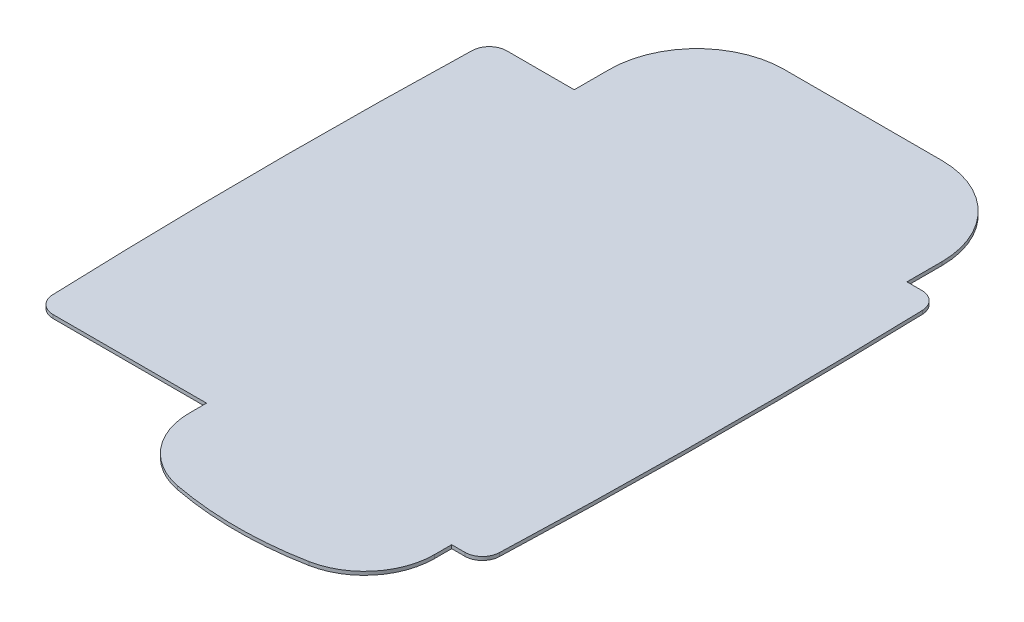
ISO-10303-21;
HEADER;
FILE_DESCRIPTION(('STEP AP214'),'2;1');
FILE_NAME('part.step','',(''),(''),'','','');
FILE_SCHEMA(('AUTOMOTIVE_DESIGN { 1 0 10303 214 1 1 1 1 }'));
ENDSEC;
DATA;
#1=APPLICATION_CONTEXT('core data for automotive mechanical design processes');
#2=APPLICATION_PROTOCOL_DEFINITION('international standard','automotive_design',2000,#1);
#3=PRODUCT_CONTEXT('',#1,'mechanical');
#4=PRODUCT('Part','Part','',(#3));
#5=PRODUCT_RELATED_PRODUCT_CATEGORY('part','',(#4));
#6=PRODUCT_DEFINITION_FORMATION('','',#4);
#7=PRODUCT_DEFINITION_CONTEXT('part definition',#1,'design');
#8=PRODUCT_DEFINITION('design','',#6,#7);
#9=PRODUCT_DEFINITION_SHAPE('','',#8);
#10=(LENGTH_UNIT() NAMED_UNIT(*) SI_UNIT(.MILLI.,.METRE.));
#11=(NAMED_UNIT(*) PLANE_ANGLE_UNIT() SI_UNIT($,.RADIAN.));
#12=(NAMED_UNIT(*) SI_UNIT($,.STERADIAN.) SOLID_ANGLE_UNIT());
#13=UNCERTAINTY_MEASURE_WITH_UNIT(LENGTH_MEASURE(1.E-05),#10,'distance_accuracy_value','');
#14=(GEOMETRIC_REPRESENTATION_CONTEXT(3) GLOBAL_UNCERTAINTY_ASSIGNED_CONTEXT((#13)) GLOBAL_UNIT_ASSIGNED_CONTEXT((#10,
#11,#12)) REPRESENTATION_CONTEXT('',''));
#15=CARTESIAN_POINT('',(0.,0.,0.));
#16=DIRECTION('',(0.,0.,1.));
#17=DIRECTION('',(1.,0.,0.));
#18=AXIS2_PLACEMENT_3D('',#15,#16,#17);
#19=CARTESIAN_POINT('',(0.,0.5,-92.5));
#20=DIRECTION('',(0.,0.,-1.));
#21=DIRECTION('',(-1.,0.,0.));
#22=AXIS2_PLACEMENT_3D('',#19,#20,#21);
#23=PLANE('',#22);
#24=DIRECTION('',(1.,0.,0.));
#25=VECTOR('',#24,1.);
#26=CARTESIAN_POINT('',(0.,-0.5,-92.5));
#27=LINE('',#26,#25);
#28=CARTESIAN_POINT('',(-15.,-0.5,-92.5));
#29=VERTEX_POINT('',#28);
#30=CARTESIAN_POINT('',(30.,-0.5,-92.5));
#31=VERTEX_POINT('',#30);
#32=EDGE_CURVE('E196',#29,#31,#27,.T.);
#33=ORIENTED_EDGE('',*,*,#32,.F.);
#34=DIRECTION('',(0.,1.,0.));
#35=VECTOR('',#34,1.);
#36=CARTESIAN_POINT('',(-15.,-0.5,-92.5));
#37=LINE('',#36,#35);
#38=CARTESIAN_POINT('',(-15.,0.5,-92.5));
#39=VERTEX_POINT('',#38);
#40=EDGE_CURVE('E179',#29,#39,#37,.T.);
#41=ORIENTED_EDGE('',*,*,#40,.T.);
#42=DIRECTION('',(1.,0.,0.));
#43=VECTOR('',#42,1.);
#44=CARTESIAN_POINT('',(0.,0.5,-92.5));
#45=LINE('',#44,#43);
#46=CARTESIAN_POINT('',(30.,0.5,-92.5));
#47=VERTEX_POINT('',#46);
#48=EDGE_CURVE('E337',#39,#47,#45,.T.);
#49=ORIENTED_EDGE('',*,*,#48,.T.);
#50=DIRECTION('',(0.,1.,0.));
#51=VECTOR('',#50,1.);
#52=CARTESIAN_POINT('',(30.,-0.5,-92.5));
#53=LINE('',#52,#51);
#54=EDGE_CURVE('E201',#31,#47,#53,.T.);
#55=ORIENTED_EDGE('',*,*,#54,.F.);
#56=EDGE_LOOP('',(#33,#41,#49,#55));
#57=FACE_BOUND('',#56,.T.);
#58=ADVANCED_FACE('F42',(#57),#23,.T.);
#59=CARTESIAN_POINT('',(0.,0.5,0.));
#60=DIRECTION('',(0.,1.,0.));
#61=DIRECTION('',(0.,0.,1.));
#62=AXIS2_PLACEMENT_3D('',#59,#60,#61);
#63=PLANE('',#62);
#64=DIRECTION('',(0.,0.,-1.));
#65=VECTOR('',#64,1.);
#66=CARTESIAN_POINT('',(-15.,0.5,72.5));
#67=LINE('',#66,#65);
#68=CARTESIAN_POINT('',(-15.,0.5,77.4061982515326));
#69=VERTEX_POINT('',#68);
#70=CARTESIAN_POINT('',(-15.,0.5,72.5));
#71=VERTEX_POINT('',#70);
#72=EDGE_CURVE('E290',#69,#71,#67,.T.);
#73=ORIENTED_EDGE('',*,*,#72,.F.);
#74=CARTESIAN_POINT('',(5.00000000000002,0.5,77.4061982515326));
#75=DIRECTION('',(0.,1.,0.));
#76=DIRECTION('',(0.,0.,1.));
#77=AXIS2_PLACEMENT_3D('',#74,#75,#76);
#78=CIRCLE('',#77,20.);
#79=CARTESIAN_POINT('',(1.25000000000002,0.5,97.0514903084097));
#80=VERTEX_POINT('',#79);
#81=EDGE_CURVE('E258',#69,#80,#78,.T.);
#82=ORIENTED_EDGE('',*,*,#81,.T.);
#83=CARTESIAN_POINT('',(20.,0.5,-1.17496997597598));
#84=DIRECTION('',(0.,1.,0.));
#85=DIRECTION('',(0.,0.,1.));
#86=AXIS2_PLACEMENT_3D('',#83,#84,#85);
#87=CIRCLE('',#86,100.);
#88=CARTESIAN_POINT('',(38.75,0.5,97.0514903084097));
#89=VERTEX_POINT('',#88);
#90=EDGE_CURVE('E288',#80,#89,#87,.T.);
#91=ORIENTED_EDGE('',*,*,#90,.T.);
#92=CARTESIAN_POINT('',(35.,0.5,77.4061982515326));
#93=DIRECTION('',(0.,1.,0.));
#94=DIRECTION('',(0.,0.,1.));
#95=AXIS2_PLACEMENT_3D('',#92,#93,#94);
#96=CIRCLE('',#95,20.);
#97=CARTESIAN_POINT('',(55.,0.5,77.4061982515326));
#98=VERTEX_POINT('',#97);
#99=EDGE_CURVE('E256',#89,#98,#96,.T.);
#100=ORIENTED_EDGE('',*,*,#99,.T.);
#101=DIRECTION('',(0.,0.,1.));
#102=VECTOR('',#101,1.);
#103=CARTESIAN_POINT('',(55.,0.5,72.5));
#104=LINE('',#103,#102);
#105=CARTESIAN_POINT('',(55.,0.5,72.5));
#106=VERTEX_POINT('',#105);
#107=EDGE_CURVE('E294',#106,#98,#104,.T.);
#108=ORIENTED_EDGE('',*,*,#107,.F.);
#109=DIRECTION('',(-1.,0.,0.));
#110=VECTOR('',#109,1.);
#111=CARTESIAN_POINT('',(55.,0.5,72.5));
#112=LINE('',#111,#110);
#113=CARTESIAN_POINT('',(58.7764057886327,0.5,72.5));
#114=VERTEX_POINT('',#113);
#115=EDGE_CURVE('E296',#114,#106,#112,.T.);
#116=ORIENTED_EDGE('',*,*,#115,.F.);
#117=CARTESIAN_POINT('',(58.7764057886327,0.5,67.5));
#118=DIRECTION('',(0.,1.,0.));
#119=DIRECTION('',(0.,0.,1.));
#120=AXIS2_PLACEMENT_3D('',#117,#118,#119);
#121=CIRCLE('',#120,5.);
#122=CARTESIAN_POINT('',(63.7730594606828,0.5,67.6828991022093));
#123=VERTEX_POINT('',#122);
#124=EDGE_CURVE('E235',#114,#123,#121,.T.);
#125=ORIENTED_EDGE('',*,*,#124,.T.);
#126=CARTESIAN_POINT('',(0.,0.5,0.));
#127=DIRECTION('',(0.,1.,0.));
#128=DIRECTION('',(0.,0.,1.));
#129=AXIS2_PLACEMENT_3D('',#126,#127,#128);
#130=ELLIPSE('',#129,350.,65.);
#131=CARTESIAN_POINT('',(64.2606055592189,0.5,-52.6412109634021));
#132=VERTEX_POINT('',#131);
#133=EDGE_CURVE('E206',#123,#132,#130,.T.);
#134=ORIENTED_EDGE('',*,*,#133,.T.);
#135=CARTESIAN_POINT('',(59.262600010621,0.5,-52.5));
#136=DIRECTION('',(0.,1.,0.));
#137=DIRECTION('',(0.,0.,1.));
#138=AXIS2_PLACEMENT_3D('',#135,#136,#137);
#139=CIRCLE('',#138,5.);
#140=CARTESIAN_POINT('',(59.262600010621,0.5,-57.5));
#141=VERTEX_POINT('',#140);
#142=EDGE_CURVE('E233',#132,#141,#139,.T.);
#143=ORIENTED_EDGE('',*,*,#142,.T.);
#144=DIRECTION('',(1.,0.,0.));
#145=VECTOR('',#144,1.);
#146=CARTESIAN_POINT('',(55.,0.5,-57.5));
#147=LINE('',#146,#145);
#148=CARTESIAN_POINT('',(55.,0.5,-57.5));
#149=VERTEX_POINT('',#148);
#150=EDGE_CURVE('E318',#149,#141,#147,.T.);
#151=ORIENTED_EDGE('',*,*,#150,.F.);
#152=DIRECTION('',(0.,0.,1.));
#153=VECTOR('',#152,1.);
#154=CARTESIAN_POINT('',(55.,0.5,-92.5));
#155=LINE('',#154,#153);
#156=CARTESIAN_POINT('',(55.,0.5,-67.5));
#157=VERTEX_POINT('',#156);
#158=EDGE_CURVE('E314',#157,#149,#155,.T.);
#159=ORIENTED_EDGE('',*,*,#158,.F.);
#160=CARTESIAN_POINT('',(30.,0.5,-67.5));
#161=DIRECTION('',(0.,1.,0.));
#162=DIRECTION('',(0.,0.,1.));
#163=AXIS2_PLACEMENT_3D('',#160,#161,#162);
#164=CIRCLE('',#163,25.);
#165=EDGE_CURVE('E399',#157,#47,#164,.T.);
#166=ORIENTED_EDGE('',*,*,#165,.T.);
#167=ORIENTED_EDGE('',*,*,#48,.F.);
#168=CARTESIAN_POINT('',(-15.,0.5,-67.5));
#169=DIRECTION('',(0.,1.,0.));
#170=DIRECTION('',(0.,0.,1.));
#171=AXIS2_PLACEMENT_3D('',#168,#169,#170);
#172=CIRCLE('',#171,25.);
#173=CARTESIAN_POINT('',(-40.,0.5,-67.5));
#174=VERTEX_POINT('',#173);
#175=EDGE_CURVE('E185',#39,#174,#172,.T.);
#176=ORIENTED_EDGE('',*,*,#175,.T.);
#177=DIRECTION('',(0.,0.,-1.));
#178=VECTOR('',#177,1.);
#179=CARTESIAN_POINT('',(-40.,0.5,-92.5));
#180=LINE('',#179,#178);
#181=CARTESIAN_POINT('',(-40.,0.5,-57.5));
#182=VERTEX_POINT('',#181);
#183=EDGE_CURVE('E329',#182,#174,#180,.T.);
#184=ORIENTED_EDGE('',*,*,#183,.F.);
#185=DIRECTION('',(1.,0.,0.));
#186=VECTOR('',#185,1.);
#187=CARTESIAN_POINT('',(-65.,0.5,-57.5));
#188=LINE('',#187,#186);
#189=CARTESIAN_POINT('',(-59.262600010621,0.5,-57.5));
#190=VERTEX_POINT('',#189);
#191=EDGE_CURVE('E327',#190,#182,#188,.T.);
#192=ORIENTED_EDGE('',*,*,#191,.F.);
#193=CARTESIAN_POINT('',(-59.262600010621,0.5,-52.5000000000001));
#194=DIRECTION('',(0.,1.,0.));
#195=DIRECTION('',(0.,0.,1.));
#196=AXIS2_PLACEMENT_3D('',#193,#194,#195);
#197=CIRCLE('',#196,5.);
#198=CARTESIAN_POINT('',(-64.2606055592189,0.5,-52.6412109634022));
#199=VERTEX_POINT('',#198);
#200=EDGE_CURVE('E239',#190,#199,#197,.T.);
#201=ORIENTED_EDGE('',*,*,#200,.T.);
#202=CARTESIAN_POINT('',(-63.7730594606828,0.5,67.6828991022094));
#203=VERTEX_POINT('',#202);
#204=EDGE_CURVE('E215',#199,#203,#130,.T.);
#205=ORIENTED_EDGE('',*,*,#204,.T.);
#206=CARTESIAN_POINT('',(-58.7764057886327,0.5,67.5000000000001));
#207=DIRECTION('',(0.,1.,0.));
#208=DIRECTION('',(0.,0.,1.));
#209=AXIS2_PLACEMENT_3D('',#206,#207,#208);
#210=CIRCLE('',#209,5.);
#211=CARTESIAN_POINT('',(-58.7764057886327,0.5,72.5));
#212=VERTEX_POINT('',#211);
#213=EDGE_CURVE('E237',#203,#212,#210,.T.);
#214=ORIENTED_EDGE('',*,*,#213,.T.);
#215=DIRECTION('',(-1.,0.,0.));
#216=VECTOR('',#215,1.);
#217=CARTESIAN_POINT('',(-65.,0.5,72.5));
#218=LINE('',#217,#216);
#219=EDGE_CURVE('E281',#71,#212,#218,.T.);
#220=ORIENTED_EDGE('',*,*,#219,.F.);
#221=EDGE_LOOP('',(#73,#82,#91,#100,#108,#116,#125,#134,#143,#151,#159,#166,#167,#176,#184,#192,
#201,#205,#214,#220));
#222=FACE_BOUND('',#221,.T.);
#223=ADVANCED_FACE('F287',(#222),#63,.T.);
#224=CARTESIAN_POINT('',(0.,-0.5,0.));
#225=DIRECTION('',(0.,1.,0.));
#226=DIRECTION('',(0.,0.,1.));
#227=AXIS2_PLACEMENT_3D('',#224,#225,#226);
#228=PLANE('',#227);
#229=CARTESIAN_POINT('',(20.,-0.5,-1.17496997597598));
#230=DIRECTION('',(0.,1.,0.));
#231=DIRECTION('',(0.,0.,1.));
#232=AXIS2_PLACEMENT_3D('',#229,#230,#231);
#233=CIRCLE('',#232,100.);
#234=CARTESIAN_POINT('',(1.25000000000002,-0.5,97.0514903084097));
#235=VERTEX_POINT('',#234);
#236=CARTESIAN_POINT('',(38.75,-0.5,97.0514903084097));
#237=VERTEX_POINT('',#236);
#238=EDGE_CURVE('E270',#235,#237,#233,.T.);
#239=ORIENTED_EDGE('',*,*,#238,.F.);
#240=CARTESIAN_POINT('',(5.00000000000002,-0.5,77.4061982515326));
#241=DIRECTION('',(0.,1.,0.));
#242=DIRECTION('',(0.,0.,1.));
#243=AXIS2_PLACEMENT_3D('',#240,#241,#242);
#244=CIRCLE('',#243,20.);
#245=CARTESIAN_POINT('',(-15.,-0.5,77.4061982515326));
#246=VERTEX_POINT('',#245);
#247=EDGE_CURVE('E50',#235,#246,#244,.F.);
#248=ORIENTED_EDGE('',*,*,#247,.T.);
#249=DIRECTION('',(0.,0.,-1.));
#250=VECTOR('',#249,1.);
#251=CARTESIAN_POINT('',(-15.,-0.5,72.5));
#252=LINE('',#251,#250);
#253=CARTESIAN_POINT('',(-15.,-0.5,72.5));
#254=VERTEX_POINT('',#253);
#255=EDGE_CURVE('E268',#246,#254,#252,.T.);
#256=ORIENTED_EDGE('',*,*,#255,.T.);
#257=DIRECTION('',(-1.,0.,0.));
#258=VECTOR('',#257,1.);
#259=CARTESIAN_POINT('',(-65.,-0.5,72.5));
#260=LINE('',#259,#258);
#261=CARTESIAN_POINT('',(-58.7764057886327,-0.5,72.5));
#262=VERTEX_POINT('',#261);
#263=EDGE_CURVE('E280',#254,#262,#260,.T.);
#264=ORIENTED_EDGE('',*,*,#263,.T.);
#265=CARTESIAN_POINT('',(-58.7764057886327,-0.5,67.5000000000001));
#266=DIRECTION('',(0.,1.,0.));
#267=DIRECTION('',(0.,0.,1.));
#268=AXIS2_PLACEMENT_3D('',#265,#266,#267);
#269=CIRCLE('',#268,5.);
#270=CARTESIAN_POINT('',(-63.7730594606828,-0.5,67.6828991022094));
#271=VERTEX_POINT('',#270);
#272=EDGE_CURVE('E227',#262,#271,#269,.F.);
#273=ORIENTED_EDGE('',*,*,#272,.T.);
#274=CARTESIAN_POINT('',(0.,-0.5,0.));
#275=DIRECTION('',(0.,1.,0.));
#276=DIRECTION('',(0.,0.,1.));
#277=AXIS2_PLACEMENT_3D('',#274,#275,#276);
#278=ELLIPSE('',#277,350.,65.);
#279=CARTESIAN_POINT('',(-64.2606055592189,-0.5,-52.6412109634022));
#280=VERTEX_POINT('',#279);
#281=EDGE_CURVE('E202',#280,#271,#278,.T.);
#282=ORIENTED_EDGE('',*,*,#281,.F.);
#283=CARTESIAN_POINT('',(-59.262600010621,-0.5,-52.5000000000001));
#284=DIRECTION('',(0.,1.,0.));
#285=DIRECTION('',(0.,0.,1.));
#286=AXIS2_PLACEMENT_3D('',#283,#284,#285);
#287=CIRCLE('',#286,5.);
#288=CARTESIAN_POINT('',(-59.262600010621,-0.5,-57.5));
#289=VERTEX_POINT('',#288);
#290=EDGE_CURVE('E229',#280,#289,#287,.F.);
#291=ORIENTED_EDGE('',*,*,#290,.T.);
#292=DIRECTION('',(1.,0.,0.));
#293=VECTOR('',#292,1.);
#294=CARTESIAN_POINT('',(0.,-0.5,-57.5));
#295=LINE('',#294,#293);
#296=CARTESIAN_POINT('',(-40.,-0.5,-57.5));
#297=VERTEX_POINT('',#296);
#298=EDGE_CURVE('E212',#289,#297,#295,.T.);
#299=ORIENTED_EDGE('',*,*,#298,.T.);
#300=DIRECTION('',(0.,0.,-1.));
#301=VECTOR('',#300,1.);
#302=CARTESIAN_POINT('',(-40.,-0.5,-92.5));
#303=LINE('',#302,#301);
#304=CARTESIAN_POINT('',(-40.,-0.5,-67.5));
#305=VERTEX_POINT('',#304);
#306=EDGE_CURVE('E198',#297,#305,#303,.T.);
#307=ORIENTED_EDGE('',*,*,#306,.T.);
#308=CARTESIAN_POINT('',(-15.,-0.5,-67.5));
#309=DIRECTION('',(0.,1.,0.));
#310=DIRECTION('',(0.,0.,1.));
#311=AXIS2_PLACEMENT_3D('',#308,#309,#310);
#312=CIRCLE('',#311,25.);
#313=EDGE_CURVE('E182',#29,#305,#312,.T.);
#314=ORIENTED_EDGE('',*,*,#313,.F.);
#315=ORIENTED_EDGE('',*,*,#32,.T.);
#316=CARTESIAN_POINT('',(30.,-0.5,-67.5));
#317=DIRECTION('',(0.,1.,0.));
#318=DIRECTION('',(0.,0.,1.));
#319=AXIS2_PLACEMENT_3D('',#316,#317,#318);
#320=CIRCLE('',#319,25.);
#321=CARTESIAN_POINT('',(55.,-0.5,-67.5));
#322=VERTEX_POINT('',#321);
#323=EDGE_CURVE('E401',#322,#31,#320,.T.);
#324=ORIENTED_EDGE('',*,*,#323,.F.);
#325=DIRECTION('',(0.,0.,1.));
#326=VECTOR('',#325,1.);
#327=CARTESIAN_POINT('',(55.,-0.5,-92.5));
#328=LINE('',#327,#326);
#329=CARTESIAN_POINT('',(55.,-0.5,-57.5));
#330=VERTEX_POINT('',#329);
#331=EDGE_CURVE('E315',#322,#330,#328,.T.);
#332=ORIENTED_EDGE('',*,*,#331,.T.);
#333=DIRECTION('',(1.,0.,0.));
#334=VECTOR('',#333,1.);
#335=CARTESIAN_POINT('',(55.,-0.5,-57.5));
#336=LINE('',#335,#334);
#337=CARTESIAN_POINT('',(59.262600010621,-0.5,-57.5));
#338=VERTEX_POINT('',#337);
#339=EDGE_CURVE('E317',#330,#338,#336,.T.);
#340=ORIENTED_EDGE('',*,*,#339,.T.);
#341=CARTESIAN_POINT('',(59.262600010621,-0.5,-52.5));
#342=DIRECTION('',(0.,1.,0.));
#343=DIRECTION('',(0.,0.,1.));
#344=AXIS2_PLACEMENT_3D('',#341,#342,#343);
#345=CIRCLE('',#344,5.);
#346=CARTESIAN_POINT('',(64.2606055592189,-0.5,-52.6412109634021));
#347=VERTEX_POINT('',#346);
#348=EDGE_CURVE('E223',#338,#347,#345,.F.);
#349=ORIENTED_EDGE('',*,*,#348,.T.);
#350=CARTESIAN_POINT('',(63.7730594606828,-0.5,67.6828991022093));
#351=VERTEX_POINT('',#350);
#352=EDGE_CURVE('E203',#351,#347,#278,.T.);
#353=ORIENTED_EDGE('',*,*,#352,.F.);
#354=CARTESIAN_POINT('',(58.7764057886327,-0.5,67.5));
#355=DIRECTION('',(0.,1.,0.));
#356=DIRECTION('',(0.,0.,1.));
#357=AXIS2_PLACEMENT_3D('',#354,#355,#356);
#358=CIRCLE('',#357,5.);
#359=CARTESIAN_POINT('',(58.7764057886327,-0.5,72.5));
#360=VERTEX_POINT('',#359);
#361=EDGE_CURVE('E225',#351,#360,#358,.F.);
#362=ORIENTED_EDGE('',*,*,#361,.T.);
#363=DIRECTION('',(-1.,0.,0.));
#364=VECTOR('',#363,1.);
#365=CARTESIAN_POINT('',(0.,-0.5,72.5));
#366=LINE('',#365,#364);
#367=CARTESIAN_POINT('',(55.,-0.5,72.5));
#368=VERTEX_POINT('',#367);
#369=EDGE_CURVE('E214',#360,#368,#366,.T.);
#370=ORIENTED_EDGE('',*,*,#369,.T.);
#371=DIRECTION('',(0.,0.,1.));
#372=VECTOR('',#371,1.);
#373=CARTESIAN_POINT('',(55.,-0.5,72.5));
#374=LINE('',#373,#372);
#375=CARTESIAN_POINT('',(55.,-0.5,77.4061982515326));
#376=VERTEX_POINT('',#375);
#377=EDGE_CURVE('E303',#368,#376,#374,.T.);
#378=ORIENTED_EDGE('',*,*,#377,.T.);
#379=CARTESIAN_POINT('',(35.,-0.5,77.4061982515326));
#380=DIRECTION('',(0.,1.,0.));
#381=DIRECTION('',(0.,0.,1.));
#382=AXIS2_PLACEMENT_3D('',#379,#380,#381);
#383=CIRCLE('',#382,20.);
#384=EDGE_CURVE('E62',#376,#237,#383,.F.);
#385=ORIENTED_EDGE('',*,*,#384,.T.);
#386=EDGE_LOOP('',(#239,#248,#256,#264,#273,#282,#291,#299,#307,#314,#315,#324,#332,#340,#349,
#353,#362,#370,#378,#385));
#387=FACE_BOUND('',#386,.T.);
#388=ADVANCED_FACE('F194',(#387),#228,.F.);
#389=CARTESIAN_POINT('',(-40.,-0.5,-92.5));
#390=DIRECTION('',(1.,0.,0.));
#391=DIRECTION('',(0.,0.,-1.));
#392=AXIS2_PLACEMENT_3D('',#389,#390,#391);
#393=PLANE('',#392);
#394=DIRECTION('',(0.,1.,0.));
#395=VECTOR('',#394,1.);
#396=CARTESIAN_POINT('',(-40.,-0.5,-67.5));
#397=LINE('',#396,#395);
#398=EDGE_CURVE('E190',#305,#174,#397,.T.);
#399=ORIENTED_EDGE('',*,*,#398,.F.);
#400=ORIENTED_EDGE('',*,*,#306,.F.);
#401=DIRECTION('',(0.,1.,0.));
#402=VECTOR('',#401,1.);
#403=CARTESIAN_POINT('',(-40.,-0.5,-57.5));
#404=LINE('',#403,#402);
#405=EDGE_CURVE('E209',#297,#182,#404,.T.);
#406=ORIENTED_EDGE('',*,*,#405,.T.);
#407=ORIENTED_EDGE('',*,*,#183,.T.);
#408=EDGE_LOOP('',(#399,#400,#406,#407));
#409=FACE_BOUND('',#408,.T.);
#410=ADVANCED_FACE('F416',(#409),#393,.F.);
#411=DIRECTION('',(0.,-1.,0.));
#412=VECTOR('',#411,1.);
#413=SURFACE_OF_LINEAR_EXTRUSION('',#130,#412);
#414=ORIENTED_EDGE('',*,*,#133,.F.);
#415=DIRECTION('',(0.,-1.,0.));
#416=VECTOR('',#415,1.);
#417=CARTESIAN_POINT('',(63.7730594606828,0.5,67.6828991022093));
#418=LINE('',#417,#416);
#419=EDGE_CURVE('E246',#123,#351,#418,.T.);
#420=ORIENTED_EDGE('',*,*,#419,.T.);
#421=ORIENTED_EDGE('',*,*,#352,.T.);
#422=DIRECTION('',(0.,-1.,0.));
#423=VECTOR('',#422,1.);
#424=CARTESIAN_POINT('',(64.2606055592189,-0.5,-52.6412109634021));
#425=LINE('',#424,#423);
#426=EDGE_CURVE('E243',#347,#132,#425,.F.);
#427=ORIENTED_EDGE('',*,*,#426,.T.);
#428=EDGE_LOOP('',(#414,#420,#421,#427));
#429=FACE_BOUND('',#428,.T.);
#430=ADVANCED_FACE('F344',(#429),#413,.F.);
#431=ORIENTED_EDGE('',*,*,#204,.F.);
#432=DIRECTION('',(0.,-1.,0.));
#433=VECTOR('',#432,1.);
#434=CARTESIAN_POINT('',(-64.2606055592189,0.5,-52.6412109634022));
#435=LINE('',#434,#433);
#436=EDGE_CURVE('E220',#199,#280,#435,.T.);
#437=ORIENTED_EDGE('',*,*,#436,.T.);
#438=ORIENTED_EDGE('',*,*,#281,.T.);
#439=DIRECTION('',(0.,-1.,0.));
#440=VECTOR('',#439,1.);
#441=CARTESIAN_POINT('',(-63.7730594606828,-0.5,67.6828991022094));
#442=LINE('',#441,#440);
#443=EDGE_CURVE('E217',#271,#203,#442,.F.);
#444=ORIENTED_EDGE('',*,*,#443,.T.);
#445=EDGE_LOOP('',(#431,#437,#438,#444));
#446=FACE_BOUND('',#445,.T.);
#447=ADVANCED_FACE('F339',(#446),#413,.F.);
#448=CARTESIAN_POINT('',(-65.,-0.5,-57.5));
#449=DIRECTION('',(0.,0.,1.));
#450=DIRECTION('',(1.,0.,0.));
#451=AXIS2_PLACEMENT_3D('',#448,#449,#450);
#452=PLANE('',#451);
#453=ORIENTED_EDGE('',*,*,#298,.F.);
#454=DIRECTION('',(0.,-1.,0.));
#455=VECTOR('',#454,1.);
#456=CARTESIAN_POINT('',(-59.262600010621,-0.5,-57.5));
#457=LINE('',#456,#455);
#458=EDGE_CURVE('E231',#289,#190,#457,.F.);
#459=ORIENTED_EDGE('',*,*,#458,.T.);
#460=ORIENTED_EDGE('',*,*,#191,.T.);
#461=ORIENTED_EDGE('',*,*,#405,.F.);
#462=EDGE_LOOP('',(#453,#459,#460,#461));
#463=FACE_BOUND('',#462,.T.);
#464=ADVANCED_FACE('F343',(#463),#452,.F.);
#465=CARTESIAN_POINT('',(55.,-0.5,-57.5));
#466=DIRECTION('',(0.,0.,1.));
#467=DIRECTION('',(1.,0.,0.));
#468=AXIS2_PLACEMENT_3D('',#465,#466,#467);
#469=PLANE('',#468);
#470=ORIENTED_EDGE('',*,*,#150,.T.);
#471=DIRECTION('',(0.,-1.,0.));
#472=VECTOR('',#471,1.);
#473=CARTESIAN_POINT('',(59.262600010621,-0.5,-57.5));
#474=LINE('',#473,#472);
#475=EDGE_CURVE('E251',#141,#338,#474,.T.);
#476=ORIENTED_EDGE('',*,*,#475,.T.);
#477=ORIENTED_EDGE('',*,*,#339,.F.);
#478=DIRECTION('',(0.,1.,0.));
#479=VECTOR('',#478,1.);
#480=CARTESIAN_POINT('',(55.,-0.5,-57.5));
#481=LINE('',#480,#479);
#482=EDGE_CURVE('E321',#330,#149,#481,.T.);
#483=ORIENTED_EDGE('',*,*,#482,.T.);
#484=EDGE_LOOP('',(#470,#476,#477,#483));
#485=FACE_BOUND('',#484,.T.);
#486=ADVANCED_FACE('F392',(#485),#469,.F.);
#487=CARTESIAN_POINT('',(55.,-0.5,-92.5));
#488=DIRECTION('',(-1.,0.,0.));
#489=DIRECTION('',(0.,0.,1.));
#490=AXIS2_PLACEMENT_3D('',#487,#488,#489);
#491=PLANE('',#490);
#492=ORIENTED_EDGE('',*,*,#331,.F.);
#493=DIRECTION('',(0.,1.,0.));
#494=VECTOR('',#493,1.);
#495=CARTESIAN_POINT('',(55.,-0.5,-67.5));
#496=LINE('',#495,#494);
#497=EDGE_CURVE('E300',#322,#157,#496,.T.);
#498=ORIENTED_EDGE('',*,*,#497,.T.);
#499=ORIENTED_EDGE('',*,*,#158,.T.);
#500=ORIENTED_EDGE('',*,*,#482,.F.);
#501=EDGE_LOOP('',(#492,#498,#499,#500));
#502=FACE_BOUND('',#501,.T.);
#503=ADVANCED_FACE('F396',(#502),#491,.F.);
#504=CARTESIAN_POINT('',(-65.,-0.5,72.5));
#505=DIRECTION('',(0.,0.,-1.));
#506=DIRECTION('',(-1.,0.,0.));
#507=AXIS2_PLACEMENT_3D('',#504,#505,#506);
#508=PLANE('',#507);
#509=ORIENTED_EDGE('',*,*,#219,.T.);
#510=DIRECTION('',(0.,-1.,0.));
#511=VECTOR('',#510,1.);
#512=CARTESIAN_POINT('',(-58.7764057886327,-0.5,72.5));
#513=LINE('',#512,#511);
#514=EDGE_CURVE('E241',#212,#262,#513,.T.);
#515=ORIENTED_EDGE('',*,*,#514,.T.);
#516=ORIENTED_EDGE('',*,*,#263,.F.);
#517=DIRECTION('',(0.,1.,0.));
#518=VECTOR('',#517,1.);
#519=CARTESIAN_POINT('',(-15.,-0.5,72.5));
#520=LINE('',#519,#518);
#521=EDGE_CURVE('E279',#254,#71,#520,.T.);
#522=ORIENTED_EDGE('',*,*,#521,.T.);
#523=EDGE_LOOP('',(#509,#515,#516,#522));
#524=FACE_BOUND('',#523,.T.);
#525=ADVANCED_FACE('F434',(#524),#508,.F.);
#526=CARTESIAN_POINT('',(-15.,-0.5,72.5));
#527=DIRECTION('',(1.,0.,0.));
#528=DIRECTION('',(0.,0.,-1.));
#529=AXIS2_PLACEMENT_3D('',#526,#527,#528);
#530=PLANE('',#529);
#531=ORIENTED_EDGE('',*,*,#255,.F.);
#532=DIRECTION('',(0.,-1.,0.));
#533=VECTOR('',#532,1.);
#534=CARTESIAN_POINT('',(-15.,-0.5,77.4061982515326));
#535=LINE('',#534,#533);
#536=EDGE_CURVE('E253',#246,#69,#535,.F.);
#537=ORIENTED_EDGE('',*,*,#536,.T.);
#538=ORIENTED_EDGE('',*,*,#72,.T.);
#539=ORIENTED_EDGE('',*,*,#521,.F.);
#540=EDGE_LOOP('',(#531,#537,#538,#539));
#541=FACE_BOUND('',#540,.T.);
#542=ADVANCED_FACE('F276',(#541),#530,.F.);
#543=CARTESIAN_POINT('',(55.,-0.5,72.5));
#544=DIRECTION('',(0.,0.,-1.));
#545=DIRECTION('',(-1.,0.,0.));
#546=AXIS2_PLACEMENT_3D('',#543,#544,#545);
#547=PLANE('',#546);
#548=ORIENTED_EDGE('',*,*,#369,.F.);
#549=DIRECTION('',(0.,-1.,0.));
#550=VECTOR('',#549,1.);
#551=CARTESIAN_POINT('',(58.7764057886327,-0.5,72.5));
#552=LINE('',#551,#550);
#553=EDGE_CURVE('E249',#360,#114,#552,.F.);
#554=ORIENTED_EDGE('',*,*,#553,.T.);
#555=ORIENTED_EDGE('',*,*,#115,.T.);
#556=DIRECTION('',(0.,1.,0.));
#557=VECTOR('',#556,1.);
#558=CARTESIAN_POINT('',(55.,-0.5,72.5));
#559=LINE('',#558,#557);
#560=EDGE_CURVE('E304',#368,#106,#559,.T.);
#561=ORIENTED_EDGE('',*,*,#560,.F.);
#562=EDGE_LOOP('',(#548,#554,#555,#561));
#563=FACE_BOUND('',#562,.T.);
#564=ADVANCED_FACE('F378',(#563),#547,.F.);
#565=CARTESIAN_POINT('',(55.,-0.5,72.5));
#566=DIRECTION('',(-1.,0.,0.));
#567=DIRECTION('',(0.,0.,1.));
#568=AXIS2_PLACEMENT_3D('',#565,#566,#567);
#569=PLANE('',#568);
#570=ORIENTED_EDGE('',*,*,#107,.T.);
#571=DIRECTION('',(0.,-1.,0.));
#572=VECTOR('',#571,1.);
#573=CARTESIAN_POINT('',(55.,-0.5,77.4061982515326));
#574=LINE('',#573,#572);
#575=EDGE_CURVE('E11',#98,#376,#574,.T.);
#576=ORIENTED_EDGE('',*,*,#575,.T.);
#577=ORIENTED_EDGE('',*,*,#377,.F.);
#578=ORIENTED_EDGE('',*,*,#560,.T.);
#579=EDGE_LOOP('',(#570,#576,#577,#578));
#580=FACE_BOUND('',#579,.T.);
#581=ADVANCED_FACE('F374',(#580),#569,.F.);
#582=CARTESIAN_POINT('',(20.,0.5,-1.17496997597598));
#583=DIRECTION('',(0.,-1.,0.));
#584=DIRECTION('',(0.,0.,-1.));
#585=AXIS2_PLACEMENT_3D('',#582,#583,#584);
#586=CYLINDRICAL_SURFACE('',#585,100.);
#587=ORIENTED_EDGE('',*,*,#90,.F.);
#588=DIRECTION('',(0.,-1.,0.));
#589=VECTOR('',#588,1.);
#590=CARTESIAN_POINT('',(1.25000000000002,0.5,97.0514903084097));
#591=LINE('',#590,#589);
#592=EDGE_CURVE('E263',#80,#235,#591,.T.);
#593=ORIENTED_EDGE('',*,*,#592,.T.);
#594=ORIENTED_EDGE('',*,*,#238,.T.);
#595=DIRECTION('',(0.,-1.,0.));
#596=VECTOR('',#595,1.);
#597=CARTESIAN_POINT('',(38.75,0.5,97.0514903084097));
#598=LINE('',#597,#596);
#599=EDGE_CURVE('E260',#237,#89,#598,.F.);
#600=ORIENTED_EDGE('',*,*,#599,.T.);
#601=EDGE_LOOP('',(#587,#593,#594,#600));
#602=FACE_BOUND('',#601,.T.);
#603=ADVANCED_FACE('F292',(#602),#586,.T.);
#604=CARTESIAN_POINT('',(30.,-0.5,-67.5));
#605=DIRECTION('',(0.,1.,0.));
#606=DIRECTION('',(0.,0.,1.));
#607=AXIS2_PLACEMENT_3D('',#604,#605,#606);
#608=CYLINDRICAL_SURFACE('',#607,25.);
#609=ORIENTED_EDGE('',*,*,#165,.F.);
#610=ORIENTED_EDGE('',*,*,#497,.F.);
#611=ORIENTED_EDGE('',*,*,#323,.T.);
#612=ORIENTED_EDGE('',*,*,#54,.T.);
#613=EDGE_LOOP('',(#609,#610,#611,#612));
#614=FACE_BOUND('',#613,.T.);
#615=ADVANCED_FACE('F420',(#614),#608,.T.);
#616=CARTESIAN_POINT('',(-15.,-0.5,-67.5));
#617=DIRECTION('',(0.,1.,0.));
#618=DIRECTION('',(0.,0.,1.));
#619=AXIS2_PLACEMENT_3D('',#616,#617,#618);
#620=CYLINDRICAL_SURFACE('',#619,25.);
#621=ORIENTED_EDGE('',*,*,#175,.F.);
#622=ORIENTED_EDGE('',*,*,#40,.F.);
#623=ORIENTED_EDGE('',*,*,#313,.T.);
#624=ORIENTED_EDGE('',*,*,#398,.T.);
#625=EDGE_LOOP('',(#621,#622,#623,#624));
#626=FACE_BOUND('',#625,.T.);
#627=ADVANCED_FACE('F181',(#626),#620,.T.);
#628=CARTESIAN_POINT('',(-59.262600010621,0.,-52.5000000000001));
#629=DIRECTION('',(0.,-1.,0.));
#630=DIRECTION('',(0.,0.,-1.));
#631=AXIS2_PLACEMENT_3D('',#628,#629,#630);
#632=CYLINDRICAL_SURFACE('',#631,5.);
#633=ORIENTED_EDGE('',*,*,#200,.F.);
#634=ORIENTED_EDGE('',*,*,#458,.F.);
#635=ORIENTED_EDGE('',*,*,#290,.F.);
#636=ORIENTED_EDGE('',*,*,#436,.F.);
#637=EDGE_LOOP('',(#633,#634,#635,#636));
#638=FACE_BOUND('',#637,.T.);
#639=ADVANCED_FACE('F349',(#638),#632,.T.);
#640=CARTESIAN_POINT('',(-58.7764057886327,0.,67.5000000000001));
#641=DIRECTION('',(0.,-1.,0.));
#642=DIRECTION('',(0.,0.,-1.));
#643=AXIS2_PLACEMENT_3D('',#640,#641,#642);
#644=CYLINDRICAL_SURFACE('',#643,5.);
#645=ORIENTED_EDGE('',*,*,#272,.F.);
#646=ORIENTED_EDGE('',*,*,#514,.F.);
#647=ORIENTED_EDGE('',*,*,#213,.F.);
#648=ORIENTED_EDGE('',*,*,#443,.F.);
#649=EDGE_LOOP('',(#645,#646,#647,#648));
#650=FACE_BOUND('',#649,.T.);
#651=ADVANCED_FACE('F352',(#650),#644,.T.);
#652=CARTESIAN_POINT('',(58.7764057886327,0.,67.5));
#653=DIRECTION('',(0.,-1.,0.));
#654=DIRECTION('',(0.,0.,-1.));
#655=AXIS2_PLACEMENT_3D('',#652,#653,#654);
#656=CYLINDRICAL_SURFACE('',#655,5.);
#657=ORIENTED_EDGE('',*,*,#124,.F.);
#658=ORIENTED_EDGE('',*,*,#553,.F.);
#659=ORIENTED_EDGE('',*,*,#361,.F.);
#660=ORIENTED_EDGE('',*,*,#419,.F.);
#661=EDGE_LOOP('',(#657,#658,#659,#660));
#662=FACE_BOUND('',#661,.T.);
#663=ADVANCED_FACE('F356',(#662),#656,.T.);
#664=CARTESIAN_POINT('',(59.262600010621,0.,-52.5));
#665=DIRECTION('',(0.,-1.,0.));
#666=DIRECTION('',(0.,0.,-1.));
#667=AXIS2_PLACEMENT_3D('',#664,#665,#666);
#668=CYLINDRICAL_SURFACE('',#667,5.);
#669=ORIENTED_EDGE('',*,*,#348,.F.);
#670=ORIENTED_EDGE('',*,*,#475,.F.);
#671=ORIENTED_EDGE('',*,*,#142,.F.);
#672=ORIENTED_EDGE('',*,*,#426,.F.);
#673=EDGE_LOOP('',(#669,#670,#671,#672));
#674=FACE_BOUND('',#673,.T.);
#675=ADVANCED_FACE('F360',(#674),#668,.T.);
#676=CARTESIAN_POINT('',(5.00000000000002,0.5,77.4061982515326));
#677=DIRECTION('',(0.,-1.,0.));
#678=DIRECTION('',(0.,0.,-1.));
#679=AXIS2_PLACEMENT_3D('',#676,#677,#678);
#680=CYLINDRICAL_SURFACE('',#679,20.);
#681=ORIENTED_EDGE('',*,*,#247,.F.);
#682=ORIENTED_EDGE('',*,*,#592,.F.);
#683=ORIENTED_EDGE('',*,*,#81,.F.);
#684=ORIENTED_EDGE('',*,*,#536,.F.);
#685=EDGE_LOOP('',(#681,#682,#683,#684));
#686=FACE_BOUND('',#685,.T.);
#687=ADVANCED_FACE('F283',(#686),#680,.T.);
#688=CARTESIAN_POINT('',(35.,0.5,77.4061982515326));
#689=DIRECTION('',(0.,-1.,0.));
#690=DIRECTION('',(0.,0.,-1.));
#691=AXIS2_PLACEMENT_3D('',#688,#689,#690);
#692=CYLINDRICAL_SURFACE('',#691,20.);
#693=ORIENTED_EDGE('',*,*,#384,.F.);
#694=ORIENTED_EDGE('',*,*,#575,.F.);
#695=ORIENTED_EDGE('',*,*,#99,.F.);
#696=ORIENTED_EDGE('',*,*,#599,.F.);
#697=EDGE_LOOP('',(#693,#694,#695,#696));
#698=FACE_BOUND('',#697,.T.);
#699=ADVANCED_FACE('F44',(#698),#692,.T.);
#700=CLOSED_SHELL('',(#58,#223,#388,#410,#430,#447,#464,#486,#503,#525,#542,#564,#581,#603,#615,
#627,#639,#651,#663,#675,#687,#699));
#701=MANIFOLD_SOLID_BREP('B2',#700);
#702=ADVANCED_BREP_SHAPE_REPRESENTATION('',(#18,#701),#14);
#703=SHAPE_DEFINITION_REPRESENTATION(#9,#702);
ENDSEC;
END-ISO-10303-21;
